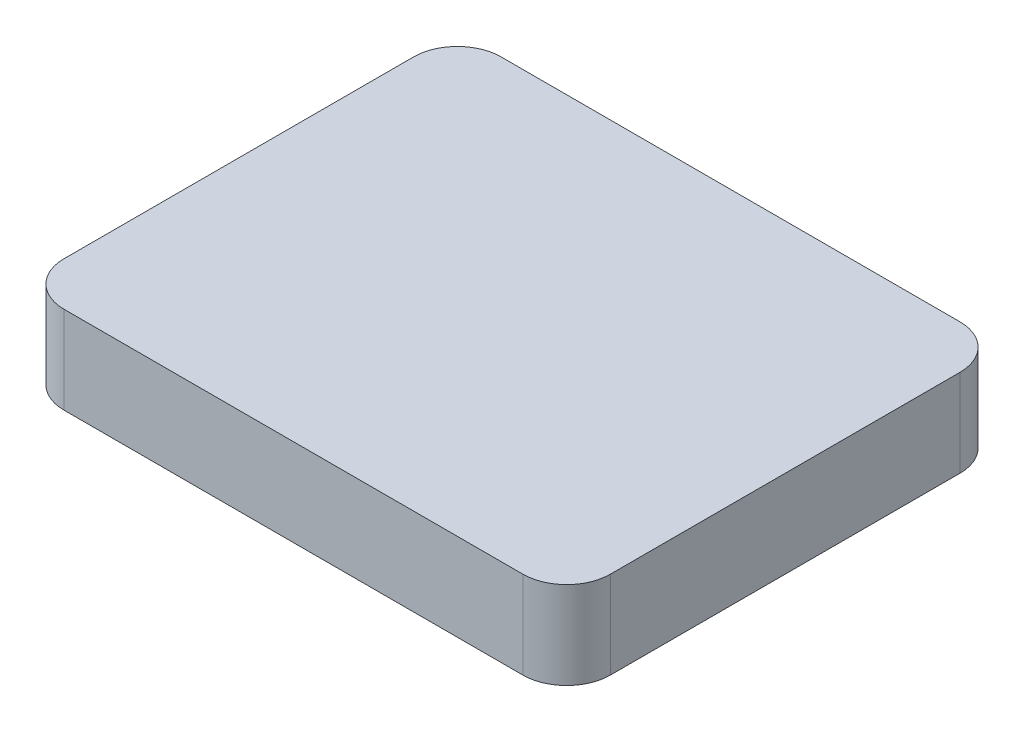
ISO-10303-21;
HEADER;
FILE_DESCRIPTION(('STEP AP214'),'2;1');
FILE_NAME('part.step','',(''),(''),'','','');
FILE_SCHEMA(('AUTOMOTIVE_DESIGN { 1 0 10303 214 1 1 1 1 }'));
ENDSEC;
DATA;
#1=APPLICATION_CONTEXT('core data for automotive mechanical design processes');
#2=APPLICATION_PROTOCOL_DEFINITION('international standard','automotive_design',2000,#1);
#3=PRODUCT_CONTEXT('',#1,'mechanical');
#4=PRODUCT('Part','Part','',(#3));
#5=PRODUCT_RELATED_PRODUCT_CATEGORY('part','',(#4));
#6=PRODUCT_DEFINITION_FORMATION('','',#4);
#7=PRODUCT_DEFINITION_CONTEXT('part definition',#1,'design');
#8=PRODUCT_DEFINITION('design','',#6,#7);
#9=PRODUCT_DEFINITION_SHAPE('','',#8);
#10=(LENGTH_UNIT() NAMED_UNIT(*) SI_UNIT(.MILLI.,.METRE.));
#11=(NAMED_UNIT(*) PLANE_ANGLE_UNIT() SI_UNIT($,.RADIAN.));
#12=(NAMED_UNIT(*) SI_UNIT($,.STERADIAN.) SOLID_ANGLE_UNIT());
#13=UNCERTAINTY_MEASURE_WITH_UNIT(LENGTH_MEASURE(1.E-05),#10,'distance_accuracy_value','');
#14=(GEOMETRIC_REPRESENTATION_CONTEXT(3) GLOBAL_UNCERTAINTY_ASSIGNED_CONTEXT((#13)) GLOBAL_UNIT_ASSIGNED_CONTEXT((#10,
#11,#12)) REPRESENTATION_CONTEXT('',''));
#15=CARTESIAN_POINT('',(0.,0.,0.));
#16=DIRECTION('',(0.,0.,1.));
#17=DIRECTION('',(1.,0.,0.));
#18=AXIS2_PLACEMENT_3D('',#15,#16,#17);
#19=CARTESIAN_POINT('',(125.,40.,100.));
#20=DIRECTION('',(-1.,0.,0.));
#21=DIRECTION('',(0.,0.,1.));
#22=AXIS2_PLACEMENT_3D('',#19,#20,#21);
#23=PLANE('',#22);
#24=DIRECTION('',(0.,0.,-1.));
#25=VECTOR('',#24,1.);
#26=CARTESIAN_POINT('',(125.,0.,100.));
#27=LINE('',#26,#25);
#28=CARTESIAN_POINT('',(125.,0.,80.));
#29=VERTEX_POINT('',#28);
#30=CARTESIAN_POINT('',(125.,0.,-80.));
#31=VERTEX_POINT('',#30);
#32=EDGE_CURVE('E163',#29,#31,#27,.T.);
#33=ORIENTED_EDGE('',*,*,#32,.T.);
#34=DIRECTION('',(0.,-1.,0.));
#35=VECTOR('',#34,1.);
#36=CARTESIAN_POINT('',(125.,40.,-80.));
#37=LINE('',#36,#35);
#38=CARTESIAN_POINT('',(125.,40.,-80.));
#39=VERTEX_POINT('',#38);
#40=EDGE_CURVE('E11',#31,#39,#37,.F.);
#41=ORIENTED_EDGE('',*,*,#40,.T.);
#42=DIRECTION('',(0.,0.,-1.));
#43=VECTOR('',#42,1.);
#44=CARTESIAN_POINT('',(125.,40.,100.));
#45=LINE('',#44,#43);
#46=CARTESIAN_POINT('',(125.,40.,80.));
#47=VERTEX_POINT('',#46);
#48=EDGE_CURVE('E131',#47,#39,#45,.T.);
#49=ORIENTED_EDGE('',*,*,#48,.F.);
#50=DIRECTION('',(0.,-1.,0.));
#51=VECTOR('',#50,1.);
#52=CARTESIAN_POINT('',(125.,40.,80.));
#53=LINE('',#52,#51);
#54=EDGE_CURVE('E47',#47,#29,#53,.T.);
#55=ORIENTED_EDGE('',*,*,#54,.T.);
#56=EDGE_LOOP('',(#33,#41,#49,#55));
#57=FACE_BOUND('',#56,.T.);
#58=ADVANCED_FACE('F39',(#57),#23,.F.);
#59=CARTESIAN_POINT('',(-125.,40.,-100.));
#60=DIRECTION('',(0.,0.,1.));
#61=DIRECTION('',(1.,0.,0.));
#62=AXIS2_PLACEMENT_3D('',#59,#60,#61);
#63=PLANE('',#62);
#64=DIRECTION('',(-1.,0.,0.));
#65=VECTOR('',#64,1.);
#66=CARTESIAN_POINT('',(-125.,0.,-100.));
#67=LINE('',#66,#65);
#68=CARTESIAN_POINT('',(105.,0.,-100.));
#69=VERTEX_POINT('',#68);
#70=CARTESIAN_POINT('',(-105.,0.,-100.));
#71=VERTEX_POINT('',#70);
#72=EDGE_CURVE('E136',#69,#71,#67,.T.);
#73=ORIENTED_EDGE('',*,*,#72,.T.);
#74=DIRECTION('',(0.,-1.,0.));
#75=VECTOR('',#74,1.);
#76=CARTESIAN_POINT('',(-105.,40.,-100.));
#77=LINE('',#76,#75);
#78=CARTESIAN_POINT('',(-105.,40.,-100.));
#79=VERTEX_POINT('',#78);
#80=EDGE_CURVE('E54',#71,#79,#77,.F.);
#81=ORIENTED_EDGE('',*,*,#80,.T.);
#82=DIRECTION('',(-1.,0.,0.));
#83=VECTOR('',#82,1.);
#84=CARTESIAN_POINT('',(-125.,40.,-100.));
#85=LINE('',#84,#83);
#86=CARTESIAN_POINT('',(105.,40.,-100.));
#87=VERTEX_POINT('',#86);
#88=EDGE_CURVE('E134',#87,#79,#85,.T.);
#89=ORIENTED_EDGE('',*,*,#88,.F.);
#90=DIRECTION('',(0.,-1.,0.));
#91=VECTOR('',#90,1.);
#92=CARTESIAN_POINT('',(105.,40.,-100.));
#93=LINE('',#92,#91);
#94=EDGE_CURVE('E155',#87,#69,#93,.T.);
#95=ORIENTED_EDGE('',*,*,#94,.T.);
#96=EDGE_LOOP('',(#73,#81,#89,#95));
#97=FACE_BOUND('',#96,.T.);
#98=ADVANCED_FACE('F183',(#97),#63,.F.);
#99=CARTESIAN_POINT('',(-125.,40.,100.));
#100=DIRECTION('',(1.,0.,0.));
#101=DIRECTION('',(0.,0.,-1.));
#102=AXIS2_PLACEMENT_3D('',#99,#100,#101);
#103=PLANE('',#102);
#104=DIRECTION('',(0.,0.,1.));
#105=VECTOR('',#104,1.);
#106=CARTESIAN_POINT('',(-125.,0.,100.));
#107=LINE('',#106,#105);
#108=CARTESIAN_POINT('',(-125.,0.,-80.));
#109=VERTEX_POINT('',#108);
#110=CARTESIAN_POINT('',(-125.,0.,80.));
#111=VERTEX_POINT('',#110);
#112=EDGE_CURVE('E132',#109,#111,#107,.T.);
#113=ORIENTED_EDGE('',*,*,#112,.T.);
#114=DIRECTION('',(0.,-1.,0.));
#115=VECTOR('',#114,1.);
#116=CARTESIAN_POINT('',(-125.,40.,80.));
#117=LINE('',#116,#115);
#118=CARTESIAN_POINT('',(-125.,40.,80.));
#119=VERTEX_POINT('',#118);
#120=EDGE_CURVE('E110',#111,#119,#117,.F.);
#121=ORIENTED_EDGE('',*,*,#120,.T.);
#122=DIRECTION('',(0.,0.,1.));
#123=VECTOR('',#122,1.);
#124=CARTESIAN_POINT('',(-125.,40.,100.));
#125=LINE('',#124,#123);
#126=CARTESIAN_POINT('',(-125.,40.,-80.));
#127=VERTEX_POINT('',#126);
#128=EDGE_CURVE('E171',#127,#119,#125,.T.);
#129=ORIENTED_EDGE('',*,*,#128,.F.);
#130=DIRECTION('',(0.,-1.,0.));
#131=VECTOR('',#130,1.);
#132=CARTESIAN_POINT('',(-125.,40.,-80.));
#133=LINE('',#132,#131);
#134=EDGE_CURVE('E115',#127,#109,#133,.T.);
#135=ORIENTED_EDGE('',*,*,#134,.T.);
#136=EDGE_LOOP('',(#113,#121,#129,#135));
#137=FACE_BOUND('',#136,.T.);
#138=ADVANCED_FACE('F182',(#137),#103,.F.);
#139=CARTESIAN_POINT('',(-125.,40.,100.));
#140=DIRECTION('',(0.,0.,-1.));
#141=DIRECTION('',(-1.,0.,0.));
#142=AXIS2_PLACEMENT_3D('',#139,#140,#141);
#143=PLANE('',#142);
#144=DIRECTION('',(1.,0.,0.));
#145=VECTOR('',#144,1.);
#146=CARTESIAN_POINT('',(-125.,40.,100.));
#147=LINE('',#146,#145);
#148=CARTESIAN_POINT('',(-105.,40.,100.));
#149=VERTEX_POINT('',#148);
#150=CARTESIAN_POINT('',(105.,40.,100.));
#151=VERTEX_POINT('',#150);
#152=EDGE_CURVE('E125',#149,#151,#147,.T.);
#153=ORIENTED_EDGE('',*,*,#152,.F.);
#154=DIRECTION('',(0.,-1.,0.));
#155=VECTOR('',#154,1.);
#156=CARTESIAN_POINT('',(-105.,40.,100.));
#157=LINE('',#156,#155);
#158=CARTESIAN_POINT('',(-105.,0.,100.));
#159=VERTEX_POINT('',#158);
#160=EDGE_CURVE('E109',#149,#159,#157,.T.);
#161=ORIENTED_EDGE('',*,*,#160,.T.);
#162=DIRECTION('',(1.,0.,0.));
#163=VECTOR('',#162,1.);
#164=CARTESIAN_POINT('',(-125.,0.,100.));
#165=LINE('',#164,#163);
#166=CARTESIAN_POINT('',(105.,0.,100.));
#167=VERTEX_POINT('',#166);
#168=EDGE_CURVE('E122',#159,#167,#165,.T.);
#169=ORIENTED_EDGE('',*,*,#168,.T.);
#170=DIRECTION('',(0.,-1.,0.));
#171=VECTOR('',#170,1.);
#172=CARTESIAN_POINT('',(105.,40.,100.));
#173=LINE('',#172,#171);
#174=EDGE_CURVE('E127',#167,#151,#173,.F.);
#175=ORIENTED_EDGE('',*,*,#174,.T.);
#176=EDGE_LOOP('',(#153,#161,#169,#175));
#177=FACE_BOUND('',#176,.T.);
#178=ADVANCED_FACE('F121',(#177),#143,.F.);
#179=CARTESIAN_POINT('',(0.,40.,0.));
#180=DIRECTION('',(0.,-1.,0.));
#181=DIRECTION('',(0.,0.,-1.));
#182=AXIS2_PLACEMENT_3D('',#179,#180,#181);
#183=PLANE('',#182);
#184=ORIENTED_EDGE('',*,*,#128,.T.);
#185=CARTESIAN_POINT('',(-105.,40.,80.));
#186=DIRECTION('',(0.,-1.,0.));
#187=DIRECTION('',(0.,0.,-1.));
#188=AXIS2_PLACEMENT_3D('',#185,#186,#187);
#189=CIRCLE('',#188,20.);
#190=EDGE_CURVE('E153',#119,#149,#189,.F.);
#191=ORIENTED_EDGE('',*,*,#190,.T.);
#192=ORIENTED_EDGE('',*,*,#152,.T.);
#193=CARTESIAN_POINT('',(105.,40.,80.));
#194=DIRECTION('',(0.,-1.,0.));
#195=DIRECTION('',(0.,0.,-1.));
#196=AXIS2_PLACEMENT_3D('',#193,#194,#195);
#197=CIRCLE('',#196,20.);
#198=EDGE_CURVE('E148',#151,#47,#197,.F.);
#199=ORIENTED_EDGE('',*,*,#198,.T.);
#200=ORIENTED_EDGE('',*,*,#48,.T.);
#201=CARTESIAN_POINT('',(105.,40.,-80.));
#202=DIRECTION('',(0.,-1.,0.));
#203=DIRECTION('',(0.,0.,-1.));
#204=AXIS2_PLACEMENT_3D('',#201,#202,#203);
#205=CIRCLE('',#204,20.);
#206=EDGE_CURVE('E61',#39,#87,#205,.F.);
#207=ORIENTED_EDGE('',*,*,#206,.T.);
#208=ORIENTED_EDGE('',*,*,#88,.T.);
#209=CARTESIAN_POINT('',(-105.,40.,-80.));
#210=DIRECTION('',(0.,-1.,0.));
#211=DIRECTION('',(0.,0.,-1.));
#212=AXIS2_PLACEMENT_3D('',#209,#210,#211);
#213=CIRCLE('',#212,20.);
#214=EDGE_CURVE('E151',#79,#127,#213,.F.);
#215=ORIENTED_EDGE('',*,*,#214,.T.);
#216=EDGE_LOOP('',(#184,#191,#192,#199,#200,#207,#208,#215));
#217=FACE_BOUND('',#216,.T.);
#218=ADVANCED_FACE('F175',(#217),#183,.F.);
#219=CARTESIAN_POINT('',(0.,0.,0.));
#220=DIRECTION('',(0.,-1.,0.));
#221=DIRECTION('',(0.,0.,-1.));
#222=AXIS2_PLACEMENT_3D('',#219,#220,#221);
#223=PLANE('',#222);
#224=ORIENTED_EDGE('',*,*,#168,.F.);
#225=CARTESIAN_POINT('',(-105.,0.,80.));
#226=DIRECTION('',(0.,-1.,0.));
#227=DIRECTION('',(0.,0.,-1.));
#228=AXIS2_PLACEMENT_3D('',#225,#226,#227);
#229=CIRCLE('',#228,20.);
#230=EDGE_CURVE('E105',#159,#111,#229,.T.);
#231=ORIENTED_EDGE('',*,*,#230,.T.);
#232=ORIENTED_EDGE('',*,*,#112,.F.);
#233=CARTESIAN_POINT('',(-105.,0.,-80.));
#234=DIRECTION('',(0.,-1.,0.));
#235=DIRECTION('',(0.,0.,-1.));
#236=AXIS2_PLACEMENT_3D('',#233,#234,#235);
#237=CIRCLE('',#236,20.);
#238=EDGE_CURVE('E116',#109,#71,#237,.T.);
#239=ORIENTED_EDGE('',*,*,#238,.T.);
#240=ORIENTED_EDGE('',*,*,#72,.F.);
#241=CARTESIAN_POINT('',(105.,0.,-80.));
#242=DIRECTION('',(0.,-1.,0.));
#243=DIRECTION('',(0.,0.,-1.));
#244=AXIS2_PLACEMENT_3D('',#241,#242,#243);
#245=CIRCLE('',#244,20.);
#246=EDGE_CURVE('E142',#69,#31,#245,.T.);
#247=ORIENTED_EDGE('',*,*,#246,.T.);
#248=ORIENTED_EDGE('',*,*,#32,.F.);
#249=CARTESIAN_POINT('',(105.,0.,80.));
#250=DIRECTION('',(0.,-1.,0.));
#251=DIRECTION('',(0.,0.,-1.));
#252=AXIS2_PLACEMENT_3D('',#249,#250,#251);
#253=CIRCLE('',#252,20.);
#254=EDGE_CURVE('E126',#29,#167,#253,.T.);
#255=ORIENTED_EDGE('',*,*,#254,.T.);
#256=EDGE_LOOP('',(#224,#231,#232,#239,#240,#247,#248,#255));
#257=FACE_BOUND('',#256,.T.);
#258=ADVANCED_FACE('F129',(#257),#223,.T.);
#259=CARTESIAN_POINT('',(-105.,40.,80.));
#260=DIRECTION('',(0.,-1.,0.));
#261=DIRECTION('',(0.,0.,-1.));
#262=AXIS2_PLACEMENT_3D('',#259,#260,#261);
#263=CYLINDRICAL_SURFACE('',#262,20.);
#264=ORIENTED_EDGE('',*,*,#190,.F.);
#265=ORIENTED_EDGE('',*,*,#120,.F.);
#266=ORIENTED_EDGE('',*,*,#230,.F.);
#267=ORIENTED_EDGE('',*,*,#160,.F.);
#268=EDGE_LOOP('',(#264,#265,#266,#267));
#269=FACE_BOUND('',#268,.T.);
#270=ADVANCED_FACE('F108',(#269),#263,.T.);
#271=CARTESIAN_POINT('',(-105.,40.,-80.));
#272=DIRECTION('',(0.,-1.,0.));
#273=DIRECTION('',(0.,0.,-1.));
#274=AXIS2_PLACEMENT_3D('',#271,#272,#273);
#275=CYLINDRICAL_SURFACE('',#274,20.);
#276=ORIENTED_EDGE('',*,*,#214,.F.);
#277=ORIENTED_EDGE('',*,*,#80,.F.);
#278=ORIENTED_EDGE('',*,*,#238,.F.);
#279=ORIENTED_EDGE('',*,*,#134,.F.);
#280=EDGE_LOOP('',(#276,#277,#278,#279));
#281=FACE_BOUND('',#280,.T.);
#282=ADVANCED_FACE('F180',(#281),#275,.T.);
#283=CARTESIAN_POINT('',(105.,40.,-80.));
#284=DIRECTION('',(0.,-1.,0.));
#285=DIRECTION('',(0.,0.,-1.));
#286=AXIS2_PLACEMENT_3D('',#283,#284,#285);
#287=CYLINDRICAL_SURFACE('',#286,20.);
#288=ORIENTED_EDGE('',*,*,#206,.F.);
#289=ORIENTED_EDGE('',*,*,#40,.F.);
#290=ORIENTED_EDGE('',*,*,#246,.F.);
#291=ORIENTED_EDGE('',*,*,#94,.F.);
#292=EDGE_LOOP('',(#288,#289,#290,#291));
#293=FACE_BOUND('',#292,.T.);
#294=ADVANCED_FACE('F185',(#293),#287,.T.);
#295=CARTESIAN_POINT('',(105.,40.,80.));
#296=DIRECTION('',(0.,-1.,0.));
#297=DIRECTION('',(0.,0.,-1.));
#298=AXIS2_PLACEMENT_3D('',#295,#296,#297);
#299=CYLINDRICAL_SURFACE('',#298,20.);
#300=ORIENTED_EDGE('',*,*,#198,.F.);
#301=ORIENTED_EDGE('',*,*,#174,.F.);
#302=ORIENTED_EDGE('',*,*,#254,.F.);
#303=ORIENTED_EDGE('',*,*,#54,.F.);
#304=EDGE_LOOP('',(#300,#301,#302,#303));
#305=FACE_BOUND('',#304,.T.);
#306=ADVANCED_FACE('F41',(#305),#299,.T.);
#307=CLOSED_SHELL('',(#58,#98,#138,#178,#218,#258,#270,#282,#294,#306));
#308=MANIFOLD_SOLID_BREP('B2',#307);
#309=ADVANCED_BREP_SHAPE_REPRESENTATION('',(#18,#308),#14);
#310=SHAPE_DEFINITION_REPRESENTATION(#9,#309);
ENDSEC;
END-ISO-10303-21;
